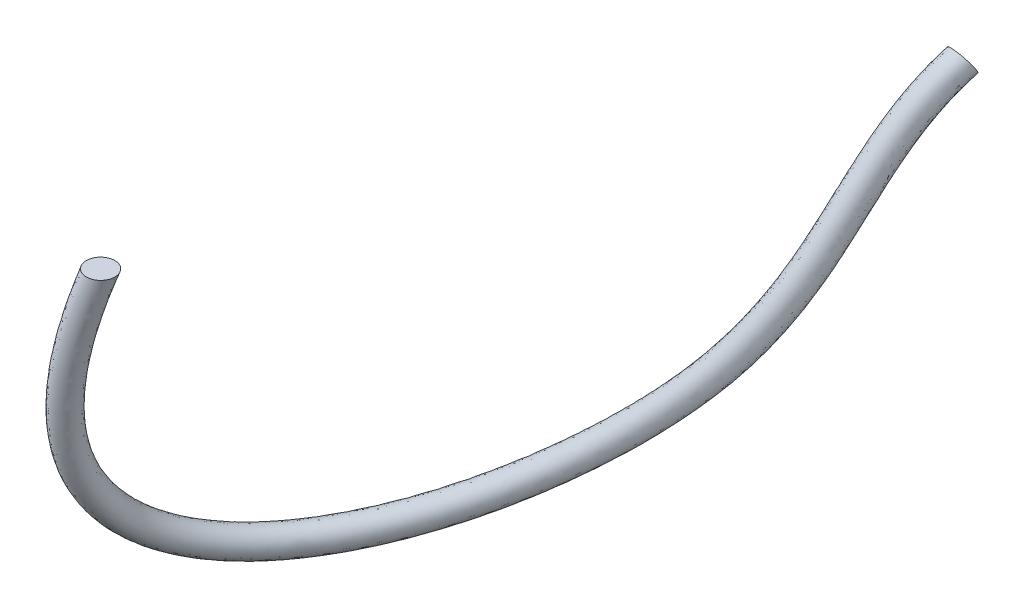
ISO-10303-21;
HEADER;
FILE_DESCRIPTION(('STEP AP214'),'2;1');
FILE_NAME('part.step','',(''),(''),'','','');
FILE_SCHEMA(('AUTOMOTIVE_DESIGN { 1 0 10303 214 1 1 1 1 }'));
ENDSEC;
DATA;
#1=APPLICATION_CONTEXT('core data for automotive mechanical design processes');
#2=APPLICATION_PROTOCOL_DEFINITION('international standard','automotive_design',2000,#1);
#3=PRODUCT_CONTEXT('',#1,'mechanical');
#4=PRODUCT('Part','Part','',(#3));
#5=PRODUCT_RELATED_PRODUCT_CATEGORY('part','',(#4));
#6=PRODUCT_DEFINITION_FORMATION('','',#4);
#7=PRODUCT_DEFINITION_CONTEXT('part definition',#1,'design');
#8=PRODUCT_DEFINITION('design','',#6,#7);
#9=PRODUCT_DEFINITION_SHAPE('','',#8);
#10=(LENGTH_UNIT() NAMED_UNIT(*) SI_UNIT(.MILLI.,.METRE.));
#11=(NAMED_UNIT(*) PLANE_ANGLE_UNIT() SI_UNIT($,.RADIAN.));
#12=(NAMED_UNIT(*) SI_UNIT($,.STERADIAN.) SOLID_ANGLE_UNIT());
#13=UNCERTAINTY_MEASURE_WITH_UNIT(LENGTH_MEASURE(1.E-05),#10,'distance_accuracy_value','');
#14=(GEOMETRIC_REPRESENTATION_CONTEXT(3) GLOBAL_UNCERTAINTY_ASSIGNED_CONTEXT((#13)) GLOBAL_UNIT_ASSIGNED_CONTEXT((#10,
#11,#12)) REPRESENTATION_CONTEXT('',''));
#15=CARTESIAN_POINT('',(0.,0.,0.));
#16=DIRECTION('',(0.,0.,1.));
#17=DIRECTION('',(1.,0.,0.));
#18=AXIS2_PLACEMENT_3D('',#15,#16,#17);
#19=CARTESIAN_POINT('',(0.,0.,0.));
#20=DIRECTION('',(0.,1.,0.));
#21=DIRECTION('',(0.,0.,1.));
#22=AXIS2_PLACEMENT_3D('',#19,#20,#21);
#23=PLANE('',#22);
#24=CARTESIAN_POINT('',(0.,0.,0.));
#25=DIRECTION('',(0.,1.,0.));
#26=DIRECTION('',(0.,0.,1.));
#27=AXIS2_PLACEMENT_3D('',#24,#25,#26);
#28=CIRCLE('',#27,12.5);
#29=CARTESIAN_POINT('',(0.,0.,12.5));
#30=VERTEX_POINT('',#29);
#31=EDGE_CURVE('E43',#30,#30,#28,.T.);
#32=ORIENTED_EDGE('',*,*,#31,.T.);
#33=EDGE_LOOP('',(#32));
#34=FACE_BOUND('',#33,.T.);
#35=ADVANCED_FACE('F40',(#34),#23,.T.);
#36=CARTESIAN_POINT('',(-38.1434596776202,-257.669947409982,-794.647687786151));
#37=DIRECTION('',(-0.0803475442884596,-0.54448992618378,0.834910170264559));
#38=DIRECTION('',(0.80262945443268,-0.532015005271432,-0.2697146511466));
#39=AXIS2_PLACEMENT_3D('',#36,#37,#38);
#40=PLANE('',#39);
#41=CARTESIAN_POINT('',(-38.1434596776202,-257.669947409982,-794.647687786151));
#42=DIRECTION('',(-0.0803475442884596,-0.54448992618378,0.834910170264559));
#43=DIRECTION('',(0.80262945443268,-0.532015005271432,-0.2697146511466));
#44=AXIS2_PLACEMENT_3D('',#41,#42,#43);
#45=CIRCLE('',#44,12.5);
#46=CARTESIAN_POINT('',(-28.1105914972117,-264.320134975875,-798.019120925484));
#47=VERTEX_POINT('',#46);
#48=EDGE_CURVE('E10',#47,#47,#45,.T.);
#49=ORIENTED_EDGE('',*,*,#48,.F.);
#50=EDGE_LOOP('',(#49));
#51=FACE_BOUND('',#50,.T.);
#52=ADVANCED_FACE('F55',(#51),#40,.F.);
#53=CARTESIAN_POINT('',(0.,0.,12.5));
#54=CARTESIAN_POINT('',(-7.22643654470373,-22.0981024096902,15.1730505252033));
#55=CARTESIAN_POINT('',(-13.0165994020231,-42.4976913189323,16.7019674865207));
#56=CARTESIAN_POINT('',(-22.0247637005753,-80.1938845209527,17.5870203037609));
#57=CARTESIAN_POINT('',(-25.2431213451697,-97.491783177638,16.9433296021655));
#58=CARTESIAN_POINT('',(-29.3852903866435,-129.262814645988,13.5730050847368));
#59=CARTESIAN_POINT('',(-30.3084082678828,-143.738470919584,10.8448288072637));
#60=CARTESIAN_POINT('',(-30.1136822525031,-170.067905663528,3.38204420674103));
#61=CARTESIAN_POINT('',(-28.9929309105626,-181.920801158909,-1.35657103344815));
#62=CARTESIAN_POINT('',(-24.9931660764793,-203.082696926862,-12.6904131284456));
#63=CARTESIAN_POINT('',(-22.114245871861,-212.384287553253,-19.2842736404802));
#64=CARTESIAN_POINT('',(-14.9787516459672,-228.52796324278,-34.0299213708688));
#65=CARTESIAN_POINT('',(-10.7264576809941,-235.370344319365,-42.175600994914));
#66=CARTESIAN_POINT('',(-1.24387092751919,-246.846781930035,-59.7162065856771));
#67=CARTESIAN_POINT('',(3.98624744379001,-251.486460110344,-69.1109332112111));
#68=CARTESIAN_POINT('',(15.0966519139014,-258.855563993099,-88.9512139091969));
#69=CARTESIAN_POINT('',(20.9800963073928,-261.58720002139,-99.3981240003482));
#70=CARTESIAN_POINT('',(30.0624975351749,-264.405919256274,-115.760965816992));
#71=CARTESIAN_POINT('',(33.1326871165852,-265.131403185288,-121.331028889438));
#72=CARTESIAN_POINT('',(36.9938432322489,-265.780779122832,-128.431327629783));
#73=CARTESIAN_POINT('',(37.7705061665808,-265.891917029712,-129.857267208386));
#74=CARTESIAN_POINT('',(39.2440198978459,-266.217033992958,-132.745834727415));
#75=CARTESIAN_POINT('',(39.9494809848379,-266.419026808544,-134.206419828553));
#76=CARTESIAN_POINT('',(42.0966695671664,-266.952191101248,-138.602149593954));
#77=CARTESIAN_POINT('',(43.5296544837135,-267.270846455676,-141.56207507012));
#78=CARTESIAN_POINT('',(50.6899513778126,-268.691083461006,-156.503739235988));
#79=CARTESIAN_POINT('',(56.4034617176189,-269.273815850384,-168.911644278196));
#80=CARTESIAN_POINT('',(73.0274168677055,-269.773005601591,-207.300186384364));
#81=CARTESIAN_POINT('',(83.4234052787309,-268.440642392741,-234.44654726169));
#82=CARTESIAN_POINT('',(100.282037663342,-264.600671913968,-290.766401686995));
#83=CARTESIAN_POINT('',(106.745299902888,-262.091437823383,-319.941700751278));
#84=CARTESIAN_POINT('',(113.10445563016,-258.058410922712,-379.196343621189));
#85=CARTESIAN_POINT('',(112.995801969881,-256.535299705237,-409.281893088104));
#86=CARTESIAN_POINT('',(105.556938339399,-256.642756706767,-456.266185613744));
#87=CARTESIAN_POINT('',(101.374328709206,-257.190540987115,-473.205994445614));
#88=CARTESIAN_POINT('',(90.9134289057197,-258.935796418327,-506.707122077295));
#89=CARTESIAN_POINT('',(84.6345208543893,-260.13344400342,-523.269681237034));
#90=CARTESIAN_POINT('',(63.8905790184547,-264.167881709411,-572.284564952275));
#91=CARTESIAN_POINT('',(47.5174761812404,-267.445606431726,-604.07358460509));
#92=CARTESIAN_POINT('',(24.002043581718,-271.15381550669,-649.862529158656));
#93=CARTESIAN_POINT('',(16.3373665895205,-272.188693362767,-664.807824307931));
#94=CARTESIAN_POINT('',(2.16719311497959,-273.511471708991,-693.9396491149));
#95=CARTESIAN_POINT('',(-4.33784888775714,-273.798969032125,-708.126604577389));
#96=CARTESIAN_POINT('',(-15.3792389311151,-273.29114711069,-735.588254929759));
#97=CARTESIAN_POINT('',(-19.9135879857565,-272.494834174395,-748.862389960614));
#98=CARTESIAN_POINT('',(-26.2380709070387,-269.512943271503,-774.308607972348));
#99=CARTESIAN_POINT('',(-28.0259624251674,-267.328073456693,-786.473680823778));
#100=CARTESIAN_POINT('',(-28.1105914972117,-264.320134975875,-798.019120925484));
#101=CARTESIAN_POINT('',(25.,0.,12.5));
#102=CARTESIAN_POINT('',(17.7735634554565,-21.5560484991579,15.0178541856007));
#103=CARTESIAN_POINT('',(11.9655562871809,-41.322279379983,16.4339597832425));
#104=CARTESIAN_POINT('',(2.84149468494016,-77.5257264341008,17.2528787796285));
#105=CARTESIAN_POINT('',(-0.474727561976159,-93.9618253137687,16.6561688806391));
#106=CARTESIAN_POINT('',(-4.9726984861487,-123.782357530498,13.6526348915241));
#107=CARTESIAN_POINT('',(-6.15590801220209,-137.165965182119,11.2481389853081));
#108=CARTESIAN_POINT('',(-6.73783822040993,-161.222572809108,4.80814443028234));
#109=CARTESIAN_POINT('',(-6.13855954985732,-171.899438702312,0.77519044623147));
#110=CARTESIAN_POINT('',(-3.43752276937991,-190.920006213129,-8.85406082391103));
#111=CARTESIAN_POINT('',(-1.33265368066558,-199.269276110077,-14.4548524356877));
#112=CARTESIAN_POINT('',(4.1694273628803,-213.875865627127,-27.2575743299452));
#113=CARTESIAN_POINT('',(7.57107986296427,-220.129386048719,-34.4638388179643));
#114=CARTESIAN_POINT('',(15.3864047119769,-230.598641361909,-50.4431366897525));
#115=CARTESIAN_POINT('',(19.8006456858977,-234.810545838135,-59.2134493945267));
#116=CARTESIAN_POINT('',(29.210992005123,-241.219962710888,-78.1849487404263));
#117=CARTESIAN_POINT('',(34.2090876439886,-243.414910499051,-88.3831778813585));
#118=CARTESIAN_POINT('',(41.6926382835383,-245.252592418254,-104.65773492324));
#119=CARTESIAN_POINT('',(44.1832474241889,-245.623098352037,-110.245856096466));
#120=CARTESIAN_POINT('',(47.2310529339166,-245.801229038063,-117.428930869969));
#121=CARTESIAN_POINT('',(47.8309634416206,-245.809887731662,-118.879701515644));
#122=CARTESIAN_POINT('',(49.1484551824271,-246.094859800652,-121.700115315776));
#123=CARTESIAN_POINT('',(49.8558540632719,-246.342084132843,-123.080540255596));
#124=CARTESIAN_POINT('',(51.9407191298238,-246.950310045848,-127.286689080497));
#125=CARTESIAN_POINT('',(53.3379423287042,-247.318780904753,-130.128435560557));
#126=CARTESIAN_POINT('',(60.3465305671853,-248.984869840958,-144.517734678361));
#127=CARTESIAN_POINT('',(66.0248998468079,-249.752764937799,-156.605895909956));
#128=CARTESIAN_POINT('',(82.74373560863,-250.727894909121,-194.331891118719));
#129=CARTESIAN_POINT('',(93.4680536813829,-249.604996463804,-221.421135898741));
#130=CARTESIAN_POINT('',(111.314601419162,-245.917289734597,-278.334522199684));
#131=CARTESIAN_POINT('',(118.448241662186,-243.351094488952,-308.167315022962));
#132=CARTESIAN_POINT('',(126.227885042547,-238.984447249345,-369.669802609909));
#133=CARTESIAN_POINT('',(126.874240982004,-237.179555290195,-401.372766942321));
#134=CARTESIAN_POINT('',(120.192504524408,-236.85763150922,-451.692262118913));
#135=CARTESIAN_POINT('',(116.142265429002,-237.312958343789,-469.668027935364));
#136=CARTESIAN_POINT('',(105.830407148839,-238.940410746446,-504.864361742691));
#137=CARTESIAN_POINT('',(99.5683218940221,-240.112456864688,-522.090091021011));
#138=CARTESIAN_POINT('',(78.853459111942,-244.117708499376,-572.603726144439));
#139=CARTESIAN_POINT('',(62.4831810310475,-247.429995693034,-604.76543326512));
#140=CARTESIAN_POINT('',(39.1471347068645,-251.265942383546,-650.205501170179));
#141=CARTESIAN_POINT('',(31.5682988326557,-252.358049477379,-664.878068510591));
#142=CARTESIAN_POINT('',(17.6090520591855,-253.863770719443,-693.06930072317));
#143=CARTESIAN_POINT('',(11.2317644961128,-254.275434864394,-706.588322114681));
#144=CARTESIAN_POINT('',(0.401135834457462,-254.181721215409,-732.159381284638));
#145=CARTESIAN_POINT('',(-4.04434766433349,-253.67404076045,-744.203618591543));
#146=CARTESIAN_POINT('',(-10.5198735695736,-251.644917670343,-766.470806154234));
#147=CARTESIAN_POINT('',(-12.555573989885,-250.13604883484,-776.660341633179));
#148=CARTESIAN_POINT('',(-13.3345502690125,-248.108820361338,-786.024877135605));
#149=CARTESIAN_POINT('',(25.,0.,-12.5));
#150=CARTESIAN_POINT('',(17.6183671157377,-20.8359339281733,-9.98214581467968));
#151=CARTESIAN_POINT('',(11.6536599676647,-39.7968666298438,-8.53523243024376));
#152=CARTESIAN_POINT('',(2.17546600495747,-74.1622989817306,-7.52873708242996));
#153=CARTESIAN_POINT('',(-1.33747621553308,-89.5630926115168,-7.96902530174392));
#154=CARTESIAN_POINT('',(-6.35288618918579,-117.060192084796,-10.4181138873203));
#155=CARTESIAN_POINT('',(-7.85820182177527,-129.150625319064,-12.4215011464751));
#156=CARTESIAN_POINT('',(-9.339671443866,-150.493319429228,-17.6753812517816));
#157=CARTESIAN_POINT('',(-9.32364097044059,-159.751212171274,-20.9153155991508));
#158=CARTESIAN_POINT('',(-8.11752556737714,-176.181337179024,-28.5789540534811));
#159=CARTESIAN_POINT('',(-6.92414308322699,-183.37395701611,-33.0098851720352));
#160=CARTESIAN_POINT('',(-3.4507406029394,-196.277004534835,-43.3953651055419));
#161=CARTESIAN_POINT('',(-1.15771994810553,-201.983040992621,-49.3664633148801));
#162=CARTESIAN_POINT('',(4.39544880492608,-211.99575809789,-63.1199511337141));
#163=CARTESIAN_POINT('',(7.65651436310129,-216.287365040691,-70.9000187467278));
#164=CARTESIAN_POINT('',(14.7327825993159,-223.429506083646,-88.2370709569131));
#165=CARTESIAN_POINT('',(18.5436589823307,-226.27305492361,-97.7883860164612));
#166=CARTESIAN_POINT('',(24.2074948375115,-229.603993977184,-113.321904095474));
#167=CARTESIAN_POINT('',(26.0853512682817,-230.560911578704,-118.700494934154));
#168=CARTESIAN_POINT('',(28.369574901387,-231.604103038394,-125.659454812885));
#169=CARTESIAN_POINT('',(28.8103654758304,-231.804102859817,-127.069304709677));
#170=CARTESIAN_POINT('',(29.9729142892153,-232.228820885382,-129.765247279347));
#171=CARTESIAN_POINT('',(30.6672695958654,-232.44842252721,-131.066207416166));
#172=CARTESIAN_POINT('',(32.6550316964863,-233.065083439481,-135.051268206346));
#173=CARTESIAN_POINT('',(33.989319061273,-233.440318994437,-137.747085130698));
#174=CARTESIAN_POINT('',(40.6917982136632,-235.144886189417,-151.412829061195));
#175=CARTESIAN_POINT('',(46.1525416394658,-235.957919106813,-162.941530445955));
#176=CARTESIAN_POINT('',(62.2873272151911,-237.085350188856,-199.002111450921));
#177=CARTESIAN_POINT('',(72.7098093899364,-236.086128988542,-224.99657353811));
#178=CARTESIAN_POINT('',(90.1398662654815,-232.628194856876,-279.550575908069));
#179=CARTESIAN_POINT('',(97.1576150133757,-230.171348600154,-308.115156457001));
#180=CARTESIAN_POINT('',(105.052728663489,-225.932715913208,-366.795038828474));
#181=CARTESIAN_POINT('',(105.939540664367,-224.145126321202,-396.931198883521));
#182=CARTESIAN_POINT('',(100.109437272771,-223.663789009972,-444.725498498762));
#183=CARTESIAN_POINT('',(96.3991893526242,-224.04498744435,-461.943716176495));
#184=CARTESIAN_POINT('',(86.7181593818826,-225.534126266952,-495.892928264852));
#185=CARTESIAN_POINT('',(80.7481470154871,-226.641634330662,-512.626603235068));
#186=CARTESIAN_POINT('',(60.7735391479702,-230.494471489432,-561.954666075751));
#187=CARTESIAN_POINT('',(44.7171820802574,-233.761202631845,-593.694468135685));
#188=CARTESIAN_POINT('',(21.5042700346375,-237.634807010782,-638.894900061399));
#189=CARTESIAN_POINT('',(13.9089938498406,-238.756722963669,-653.556970104965));
#190=CARTESIAN_POINT('',(-0.214346823131794,-240.352571334293,-681.898430210914));
#191=CARTESIAN_POINT('',(-6.74019693470208,-240.825360084168,-695.57732518921));
#192=CARTESIAN_POINT('',(-18.0112751582004,-240.862892890352,-721.732018433997));
#193=CARTESIAN_POINT('',(-22.7526436431348,-240.42732167042,-734.201135954858));
#194=CARTESIAN_POINT('',(-29.9073907194776,-238.471120651671,-757.747228056942));
#195=CARTESIAN_POINT('',(-32.3309120218825,-236.961648349966,-768.804808122601));
#196=CARTESIAN_POINT('',(-33.4002866298295,-234.808445229552,-779.28201085694));
#197=CARTESIAN_POINT('',(0.,0.,-12.5));
#198=CARTESIAN_POINT('',(-7.38163288442249,-21.3779878387056,-9.82694947507706));
#199=CARTESIAN_POINT('',(-13.3284957215393,-40.9722785687602,-8.26722472696557));
#200=CARTESIAN_POINT('',(-22.690792380558,-76.8304570686154,-7.19459555829754));
#201=CARTESIAN_POINT('',(-26.1058699987266,-93.0930504753861,-7.68186458022427));
#202=CARTESIAN_POINT('',(-30.7654780896806,-122.540649200287,-10.497743694101));
#203=CARTESIAN_POINT('',(-32.0107020774335,-135.723131056529,-12.8248113245084));
#204=CARTESIAN_POINT('',(-32.7155154759817,-159.338652283648,-19.1014814753342));
#205=CARTESIAN_POINT('',(-32.1780123311655,-169.772574627872,-23.0470770788304));
#206=CARTESIAN_POINT('',(-29.6731688744569,-188.344027892757,-32.4153063580157));
#207=CARTESIAN_POINT('',(-27.7057352744224,-196.488968459286,-37.8393063768185));
#208=CARTESIAN_POINT('',(-22.5989196117869,-210.929102150488,-50.1677121464748));
#209=CARTESIAN_POINT('',(-19.4552574920639,-217.223999263343,-57.0782254918485));
#210=CARTESIAN_POINT('',(-12.23482683457,-228.24389866594,-72.39302102962));
#211=CARTESIAN_POINT('',(-8.15788387901627,-232.963279312979,-80.7975025634122));
#212=CARTESIAN_POINT('',(0.618442508104194,-241.065107365777,-99.0033361256837));
#213=CARTESIAN_POINT('',(5.31466764573492,-244.445344446203,-108.803332135451));
#214=CARTESIAN_POINT('',(12.5773540891481,-248.757320815077,-124.425134989226));
#215=CARTESIAN_POINT('',(15.0347909606835,-250.069216411956,-129.785667727105));
#216=CARTESIAN_POINT('',(18.1323651997179,-251.583653123164,-136.661851572705));
#217=CARTESIAN_POINT('',(18.749908200792,-251.886132157878,-138.046870402414));
#218=CARTESIAN_POINT('',(20.0684790046326,-252.350995077677,-140.810966690992));
#219=CARTESIAN_POINT('',(20.7608965174301,-252.525365202922,-142.192086989117));
#220=CARTESIAN_POINT('',(22.8109821338316,-253.066964494859,-146.366728719814));
#221=CARTESIAN_POINT('',(24.1810312162851,-253.392384545337,-149.18072464026));
#222=CARTESIAN_POINT('',(31.0352190242793,-254.851099809554,-163.398833618822));
#223=CARTESIAN_POINT('',(36.5311035102768,-255.478970019492,-175.247278814195));
#224=CARTESIAN_POINT('',(52.5710084742666,-256.130460881136,-211.970406716566));
#225=CARTESIAN_POINT('',(62.6651609873344,-254.921774917479,-238.021984901459));
#226=CARTESIAN_POINT('',(79.1073025096113,-251.311577036247,-291.982455394979));
#227=CARTESIAN_POINT('',(85.4546732539763,-248.911691934382,-319.889542185318));
#228=CARTESIAN_POINT('',(91.9292992512024,-245.006679586777,-376.321579839754));
#229=CARTESIAN_POINT('',(92.0611016522438,-243.500870736448,-404.840325028895));
#230=CARTESIAN_POINT('',(85.4738710877625,-243.448914207402,-449.299421993827));
#231=CARTESIAN_POINT('',(81.6312526328279,-243.922570087676,-465.481682686744));
#232=CARTESIAN_POINT('',(71.8011811387634,-245.529511938833,-497.735688599456));
#233=CARTESIAN_POINT('',(65.8143459759152,-246.662621469516,-513.806193451091));
#234=CARTESIAN_POINT('',(45.8106590543611,-250.544644699223,-561.635504883586));
#235=CARTESIAN_POINT('',(29.7514772304205,-253.776813370061,-593.002619475655));
#236=CARTESIAN_POINT('',(6.35917890950581,-257.522680134164,-638.551928049876));
#237=CARTESIAN_POINT('',(-1.32193839328756,-258.587366849056,-653.486725902305));
#238=CARTESIAN_POINT('',(-15.6562057673447,-260.000272323842,-682.768778602645));
#239=CARTESIAN_POINT('',(-22.309810318559,-260.348894252003,-697.115607651919));
#240=CARTESIAN_POINT('',(-33.791649923786,-259.972318785529,-725.160892079118));
#241=CARTESIAN_POINT('',(-38.6218839645578,-259.248115084178,-738.85990732393));
#242=CARTESIAN_POINT('',(-45.6255880569428,-256.339146253019,-765.585029875055));
#243=CARTESIAN_POINT('',(-47.8013004570673,-254.153672971473,-778.618147313199));
#244=CARTESIAN_POINT('',(-48.1763278580287,-251.019759844089,-791.276254646819));
#245=CARTESIAN_POINT('',(-25.,0.,-12.5));
#246=CARTESIAN_POINT('',(-32.3816328845827,-21.9200417492379,-9.67175313547444));
#247=CARTESIAN_POINT('',(-38.3106514107434,-42.1476905076766,-7.99921702368739));
#248=CARTESIAN_POINT('',(-47.5570507660734,-79.4986151555001,-6.86045403416512));
#249=CARTESIAN_POINT('',(-50.8742637819202,-96.6230083392554,-7.39470385870464));
#250=CARTESIAN_POINT('',(-55.1780699901754,-128.021106315777,-10.5773735008816));
#251=CARTESIAN_POINT('',(-56.1632023330917,-142.295636793994,-13.2281215025417));
#252=CARTESIAN_POINT('',(-56.0913595080973,-168.183985138067,-20.5275816988867));
#253=CARTESIAN_POINT('',(-55.0323836918905,-179.793937084469,-25.17883855851));
#254=CARTESIAN_POINT('',(-51.2288121815366,-200.50671860649,-36.2516586625503));
#255=CARTESIAN_POINT('',(-48.4873274656179,-209.603979902462,-42.6687275816018));
#256=CARTESIAN_POINT('',(-41.7470986206344,-225.581199766141,-56.9400591874078));
#257=CARTESIAN_POINT('',(-37.7527950360222,-232.464957534065,-64.7899876688169));
#258=CARTESIAN_POINT('',(-28.865102474066,-244.492039233991,-81.6660909255259));
#259=CARTESIAN_POINT('',(-23.9722821211338,-249.639193585268,-90.6949863800967));
#260=CARTESIAN_POINT('',(-13.4958975831075,-258.700708647909,-109.769601294454));
#261=CARTESIAN_POINT('',(-7.91432369086089,-262.617633968796,-119.818278254441));
#262=CARTESIAN_POINT('',(0.947213340784767,-267.91064765297,-135.528365882979));
#263=CARTESIAN_POINT('',(3.98423065308518,-269.577521245208,-140.870840520055));
#264=CARTESIAN_POINT('',(7.89515549804892,-271.563203207933,-147.664248332525));
#265=CARTESIAN_POINT('',(8.68945092575366,-271.968161455938,-149.024436095151));
#266=CARTESIAN_POINT('',(10.16404372005,-272.473169269972,-151.856686102636));
#267=CARTESIAN_POINT('',(10.8545234389948,-272.602307878634,-153.317966562068));
#268=CARTESIAN_POINT('',(12.966932571177,-273.068845550238,-157.682189233282));
#269=CARTESIAN_POINT('',(14.3727433712972,-273.344450096237,-160.614364149823));
#270=CARTESIAN_POINT('',(21.3786398348953,-274.557313429692,-175.384838176448));
#271=CARTESIAN_POINT('',(26.9096653810878,-275.000020932172,-187.553027182435));
#272=CARTESIAN_POINT('',(42.854689733342,-275.175571573417,-224.93870198221));
#273=CARTESIAN_POINT('',(52.6205125847324,-273.757420846416,-251.047396264809));
#274=CARTESIAN_POINT('',(68.074738753741,-269.994959215618,-304.414334881889));
#275=CARTESIAN_POINT('',(73.7517314945769,-267.652035268611,-331.663927913634));
#276=CARTESIAN_POINT('',(78.8058698389161,-264.080643260347,-385.848120851034));
#277=CARTESIAN_POINT('',(78.182662640121,-262.856615151695,-412.74945117427));
#278=CARTESIAN_POINT('',(70.8383049027539,-263.234039404832,-453.873345488891));
#279=CARTESIAN_POINT('',(66.8633159130316,-263.800152731002,-469.019649196993));
#280=CARTESIAN_POINT('',(56.8842028956442,-265.524897610715,-499.578448934061));
#281=CARTESIAN_POINT('',(50.8805449363433,-266.68360860837,-514.985783667113));
#282=CARTESIAN_POINT('',(30.847778960752,-270.594817909015,-561.316343691422));
#283=CARTESIAN_POINT('',(14.7857723805836,-273.792424108277,-592.310770815625));
#284=CARTESIAN_POINT('',(-8.78591221562587,-277.410553257546,-638.208956038352));
#285=CARTESIAN_POINT('',(-16.5528706364157,-278.418010734443,-653.416481699645));
#286=CARTESIAN_POINT('',(-31.0980647115577,-279.647973313391,-683.639126994375));
#287=CARTESIAN_POINT('',(-37.879423702416,-279.872428419838,-698.653890114627));
#288=CARTESIAN_POINT('',(-49.5720246893715,-279.081744680706,-728.589765724239));
#289=CARTESIAN_POINT('',(-54.4911242859808,-278.068908497936,-743.518678693001));
#290=CARTESIAN_POINT('',(-61.3437853944079,-274.207171854367,-773.422831693169));
#291=CARTESIAN_POINT('',(-63.2716888922522,-271.345697592979,-788.431486503798));
#292=CARTESIAN_POINT('',(-62.9523690862279,-267.231074458627,-803.270498436697));
#293=CARTESIAN_POINT('',(-25.,0.,12.5));
#294=CARTESIAN_POINT('',(-32.2264365448639,-22.6401563202225,15.3282468648059));
#295=CARTESIAN_POINT('',(-37.9987550912272,-43.6731032578816,16.9699751897989));
#296=CARTESIAN_POINT('',(-46.8910220860907,-82.8620426078046,17.9211618278933));
#297=CARTESIAN_POINT('',(-50.0115151283633,-101.021741041507,17.2304903236919));
#298=CARTESIAN_POINT('',(-53.7978822871383,-134.743271761479,13.4933752779494));
#299=CARTESIAN_POINT('',(-54.4609085235634,-150.310976657049,10.4415186292192));
#300=CARTESIAN_POINT('',(-53.4895262845963,-178.913238517947,1.95594398319972));
#301=CARTESIAN_POINT('',(-51.847302271268,-191.942163615507,-3.48833251312777));
#302=CARTESIAN_POINT('',(-46.5488093835786,-215.245387640595,-16.5267654329802));
#303=CARTESIAN_POINT('',(-42.8958380630565,-225.499298996429,-24.1136948452728));
#304=CARTESIAN_POINT('',(-34.1269306548147,-243.180060858434,-40.8022684117925));
#305=CARTESIAN_POINT('',(-29.0239952249524,-250.611302590012,-49.8873631718636));
#306=CARTESIAN_POINT('',(-17.8741465670152,-263.09492249816,-68.9892764816018));
#307=CARTESIAN_POINT('',(-11.8281507983177,-268.162374382554,-79.0084170278955));
#308=CARTESIAN_POINT('',(0.98231182267985,-276.491165275309,-99.7174790779675));
#309=CARTESIAN_POINT('',(7.75110497079701,-279.759489543729,-110.413070119338));
#310=CARTESIAN_POINT('',(18.4323567868115,-283.559246094294,-126.864196710744));
#311=CARTESIAN_POINT('',(22.0821268089814,-284.63970801854,-132.416201682411));
#312=CARTESIAN_POINT('',(26.7566335305813,-285.760329207602,-139.433724389598));
#313=CARTESIAN_POINT('',(27.7100488915411,-285.973946327761,-140.834832901129));
#314=CARTESIAN_POINT('',(29.3395846132646,-286.339208185264,-143.791554139054));
#315=CARTESIAN_POINT('',(30.043107906404,-286.495969484245,-145.33229940151));
#316=CARTESIAN_POINT('',(32.252620004509,-286.954072156649,-149.917610107411));
#317=CARTESIAN_POINT('',(33.7213666387229,-287.222912006599,-152.995714579682));
#318=CARTESIAN_POINT('',(41.0333721884399,-288.397297081054,-168.489743793614));
#319=CARTESIAN_POINT('',(46.7820235884299,-288.794866762969,-181.217392646436));
#320=CARTESIAN_POINT('',(63.3110981267809,-288.818116294062,-220.268481650008));
#321=CARTESIAN_POINT('',(73.3787568760788,-287.276288321678,-247.47195862464));
#322=CARTESIAN_POINT('',(89.2494739075214,-283.284054093339,-303.198281174305));
#323=CARTESIAN_POINT('',(95.0423581435895,-280.831781157814,-331.716086479595));
#324=CARTESIAN_POINT('',(99.981026217772,-277.132374596079,-388.722884632469));
#325=CARTESIAN_POINT('',(99.1173629577585,-275.891044120279,-417.191019233886));
#326=CARTESIAN_POINT('',(90.9213721543908,-276.427881904314,-460.840109108575));
#327=CARTESIAN_POINT('',(86.6063919894098,-277.068123630441,-476.743960955863));
#328=CARTESIAN_POINT('',(75.9964506626005,-278.931182090208,-508.549882411899));
#329=CARTESIAN_POINT('',(69.7007198147565,-280.154431142152,-524.449271453057));
#330=CARTESIAN_POINT('',(48.9276989249675,-284.218054919446,-571.96540376011));
#331=CARTESIAN_POINT('',(32.5517713314332,-287.461217170419,-603.381735945061));
#332=CARTESIAN_POINT('',(8.85695245657143,-291.041688629834,-649.519557147133));
#333=CARTESIAN_POINT('',(1.10643434638538,-292.019337248154,-664.737580105271));
#334=CARTESIAN_POINT('',(-13.2746658292263,-293.15917269854,-694.809997506631));
#335=CARTESIAN_POINT('',(-19.9074622716271,-293.322503199856,-709.664887040097));
#336=CARTESIAN_POINT('',(-31.1596136966877,-292.400573005971,-739.017128574879));
#337=CARTESIAN_POINT('',(-35.7828283071795,-291.315627588341,-753.521161329686));
#338=CARTESIAN_POINT('',(-41.9562682445038,-287.380968872663,-782.146409790461));
#339=CARTESIAN_POINT('',(-43.4963508604497,-284.520098078546,-796.287020014377));
#340=CARTESIAN_POINT('',(-42.8866327254109,-280.531449590412,-810.013364715362));
#341=CARTESIAN_POINT('',(0.,0.,12.5));
#342=CARTESIAN_POINT('',(-7.22643654470373,-22.0981024096902,15.1730505252033));
#343=CARTESIAN_POINT('',(-13.0165994020231,-42.4976913189323,16.7019674865207));
#344=CARTESIAN_POINT('',(-22.0247637005753,-80.1938845209527,17.5870203037609));
#345=CARTESIAN_POINT('',(-25.2431213451697,-97.491783177638,16.9433296021655));
#346=CARTESIAN_POINT('',(-29.3852903866435,-129.262814645988,13.5730050847368));
#347=CARTESIAN_POINT('',(-30.3084082678828,-143.738470919584,10.8448288072637));
#348=CARTESIAN_POINT('',(-30.1136822525031,-170.067905663528,3.38204420674103));
#349=CARTESIAN_POINT('',(-28.9929309105626,-181.920801158909,-1.35657103344815));
#350=CARTESIAN_POINT('',(-24.9931660764793,-203.082696926862,-12.6904131284456));
#351=CARTESIAN_POINT('',(-22.114245871861,-212.384287553253,-19.2842736404802));
#352=CARTESIAN_POINT('',(-14.9787516459672,-228.52796324278,-34.0299213708688));
#353=CARTESIAN_POINT('',(-10.7264576809941,-235.370344319365,-42.175600994914));
#354=CARTESIAN_POINT('',(-1.24387092751919,-246.846781930035,-59.7162065856771));
#355=CARTESIAN_POINT('',(3.98624744379001,-251.486460110344,-69.1109332112111));
#356=CARTESIAN_POINT('',(15.0966519139014,-258.855563993099,-88.9512139091969));
#357=CARTESIAN_POINT('',(20.9800963073928,-261.58720002139,-99.3981240003482));
#358=CARTESIAN_POINT('',(30.0624975351749,-264.405919256274,-115.760965816992));
#359=CARTESIAN_POINT('',(33.1326871165852,-265.131403185288,-121.331028889438));
#360=CARTESIAN_POINT('',(36.9938432322489,-265.780779122832,-128.431327629783));
#361=CARTESIAN_POINT('',(37.7705061665808,-265.891917029712,-129.857267208386));
#362=CARTESIAN_POINT('',(39.2440198978459,-266.217033992958,-132.745834727415));
#363=CARTESIAN_POINT('',(39.9494809848379,-266.419026808544,-134.206419828553));
#364=CARTESIAN_POINT('',(42.0966695671664,-266.952191101248,-138.602149593954));
#365=CARTESIAN_POINT('',(43.5296544837135,-267.270846455676,-141.56207507012));
#366=CARTESIAN_POINT('',(50.6899513778126,-268.691083461006,-156.503739235988));
#367=CARTESIAN_POINT('',(56.4034617176189,-269.273815850384,-168.911644278196));
#368=CARTESIAN_POINT('',(73.0274168677055,-269.773005601591,-207.300186384364));
#369=CARTESIAN_POINT('',(83.4234052787309,-268.440642392741,-234.44654726169));
#370=CARTESIAN_POINT('',(100.282037663342,-264.600671913968,-290.766401686995));
#371=CARTESIAN_POINT('',(106.745299902888,-262.091437823383,-319.941700751278));
#372=CARTESIAN_POINT('',(113.10445563016,-258.058410922712,-379.196343621189));
#373=CARTESIAN_POINT('',(112.995801969881,-256.535299705237,-409.281893088104));
#374=CARTESIAN_POINT('',(105.556938339399,-256.642756706767,-456.266185613744));
#375=CARTESIAN_POINT('',(101.374328709206,-257.190540987115,-473.205994445614));
#376=CARTESIAN_POINT('',(90.9134289057197,-258.935796418327,-506.707122077295));
#377=CARTESIAN_POINT('',(84.6345208543893,-260.13344400342,-523.269681237034));
#378=CARTESIAN_POINT('',(63.8905790184547,-264.167881709411,-572.284564952275));
#379=CARTESIAN_POINT('',(47.5174761812404,-267.445606431726,-604.07358460509));
#380=CARTESIAN_POINT('',(24.002043581718,-271.15381550669,-649.862529158656));
#381=CARTESIAN_POINT('',(16.3373665895205,-272.188693362767,-664.807824307931));
#382=CARTESIAN_POINT('',(2.16719311497959,-273.511471708991,-693.9396491149));
#383=CARTESIAN_POINT('',(-4.33784888775714,-273.798969032125,-708.126604577389));
#384=CARTESIAN_POINT('',(-15.3792389311151,-273.29114711069,-735.588254929759));
#385=CARTESIAN_POINT('',(-19.9135879857565,-272.494834174395,-748.862389960614));
#386=CARTESIAN_POINT('',(-26.2380709070387,-269.512943271503,-774.308607972348));
#387=CARTESIAN_POINT('',(-28.0259624251674,-267.328073456693,-786.473680823778));
#388=CARTESIAN_POINT('',(-28.1105914972117,-264.320134975875,-798.019120925484));
#389=(BOUNDED_SURFACE() B_SPLINE_SURFACE(3,3,((#53,#54,#55,#56,#57,#58,#59,#60,#61,#62,#63,#64,
#65,#66,#67,#68,#69,#70,#71,#72,#73,#74,#75,#76,#77,#78,#79,#80,#81,#82,#83,#84,#85,#86,#87,#88,
#89,#90,#91,#92,#93,#94,#95,#96,#97,#98,#99,#100),(#101,#102,#103,#104,#105,#106,#107,#108,#109,
#110,#111,#112,#113,#114,#115,#116,#117,#118,#119,#120,#121,#122,#123,#124,#125,#126,#127,#128,
#129,#130,#131,#132,#133,#134,#135,#136,#137,#138,#139,#140,#141,#142,#143,#144,#145,#146,#147,
#148),(#149,#150,#151,#152,#153,#154,#155,#156,#157,#158,#159,#160,#161,#162,#163,#164,#165,
#166,#167,#168,#169,#170,#171,#172,#173,#174,#175,#176,#177,#178,#179,#180,#181,#182,#183,#184,
#185,#186,#187,#188,#189,#190,#191,#192,#193,#194,#195,#196),(#197,#198,#199,#200,#201,#202,
#203,#204,#205,#206,#207,#208,#209,#210,#211,#212,#213,#214,#215,#216,#217,#218,#219,#220,#221,
#222,#223,#224,#225,#226,#227,#228,#229,#230,#231,#232,#233,#234,#235,#236,#237,#238,#239,#240,
#241,#242,#243,#244),(#245,#246,#247,#248,#249,#250,#251,#252,#253,#254,#255,#256,#257,#258,
#259,#260,#261,#262,#263,#264,#265,#266,#267,#268,#269,#270,#271,#272,#273,#274,#275,#276,#277,
#278,#279,#280,#281,#282,#283,#284,#285,#286,#287,#288,#289,#290,#291,#292),(#293,#294,#295,
#296,#297,#298,#299,#300,#301,#302,#303,#304,#305,#306,#307,#308,#309,#310,#311,#312,#313,#314,
#315,#316,#317,#318,#319,#320,#321,#322,#323,#324,#325,#326,#327,#328,#329,#330,#331,#332,#333,
#334,#335,#336,#337,#338,#339,#340),(#341,#342,#343,#344,#345,#346,#347,#348,#349,#350,#351,
#352,#353,#354,#355,#356,#357,#358,#359,#360,#361,#362,#363,#364,#365,#366,#367,#368,#369,#370,
#371,#372,#373,#374,#375,#376,#377,#378,#379,#380,#381,#382,#383,#384,#385,#386,#387,#388)),
.UNSPECIFIED.,.T.,.F.,.F.) B_SPLINE_SURFACE_WITH_KNOTS((4,3,4),(4,2,2,2,2,2,2,2,2,2,2,2,2,2,2,2,
2,2,2,2,2,2,2,4),(0.,0.5,1.),(0.,0.0397677598665083,0.0795355197330167,0.119303279599525,
0.159071039466033,0.198838799332542,0.23860655919905,0.278374319065558,0.318142078932067,
0.338025958865321,0.342996928848634,0.347967898831948,0.357909838798575,0.397677598665083,
0.4772131183981,0.556748638131117,0.636284157864134,0.681748638131117,0.7272131183981,
0.818142078932067,0.86360655919905,0.909071039466033,0.954535519733017,1.),
.UNSPECIFIED.) GEOMETRIC_REPRESENTATION_ITEM() RATIONAL_B_SPLINE_SURFACE(((1.,1.,1.,1.,1.,1.,1.,
1.,1.,1.,1.,1.,1.,1.,1.,1.,1.,1.,1.,1.,1.,1.,1.,1.,1.,1.,1.,1.,1.,1.,1.,1.,1.,1.,1.,1.,1.,1.,1.,
1.,1.,1.,1.,1.,1.,1.,1.,1.),(0.333333333333333,0.333333333333333,0.333333333333333,
0.333333333333333,0.333333333333333,0.333333333333333,0.333333333333333,0.333333333333333,
0.333333333333333,0.333333333333333,0.333333333333333,0.333333333333333,0.333333333333333,
0.333333333333333,0.333333333333333,0.333333333333333,0.333333333333333,0.333333333333333,
0.333333333333333,0.333333333333333,0.333333333333333,0.333333333333333,0.333333333333333,
0.333333333333333,0.333333333333333,0.333333333333333,0.333333333333333,0.333333333333333,
0.333333333333333,0.333333333333333,0.333333333333333,0.333333333333333,0.333333333333333,
0.333333333333333,0.333333333333333,0.333333333333333,0.333333333333333,0.333333333333333,
0.333333333333333,0.333333333333333,0.333333333333333,0.333333333333333,0.333333333333333,
0.333333333333333,0.333333333333333,0.333333333333333,0.333333333333333,0.333333333333333),
(0.333333333333333,0.333333333333333,0.333333333333333,0.333333333333333,0.333333333333333,
0.333333333333333,0.333333333333333,0.333333333333333,0.333333333333333,0.333333333333333,
0.333333333333333,0.333333333333333,0.333333333333333,0.333333333333333,0.333333333333333,
0.333333333333333,0.333333333333333,0.333333333333333,0.333333333333333,0.333333333333333,
0.333333333333333,0.333333333333333,0.333333333333333,0.333333333333333,0.333333333333333,
0.333333333333333,0.333333333333333,0.333333333333333,0.333333333333333,0.333333333333333,
0.333333333333333,0.333333333333333,0.333333333333333,0.333333333333333,0.333333333333333,
0.333333333333333,0.333333333333333,0.333333333333333,0.333333333333333,0.333333333333333,
0.333333333333333,0.333333333333333,0.333333333333333,0.333333333333333,0.333333333333333,
0.333333333333333,0.333333333333333,0.333333333333333),(1.,1.,1.,1.,1.,1.,1.,1.,1.,1.,1.,1.,1.,
1.,1.,1.,1.,1.,1.,1.,1.,1.,1.,1.,1.,1.,1.,1.,1.,1.,1.,1.,1.,1.,1.,1.,1.,1.,1.,1.,1.,1.,1.,1.,1.,
1.,1.,1.),(0.333333333333333,0.333333333333333,0.333333333333333,0.333333333333333,
0.333333333333333,0.333333333333333,0.333333333333333,0.333333333333333,0.333333333333333,
0.333333333333333,0.333333333333333,0.333333333333333,0.333333333333333,0.333333333333333,
0.333333333333333,0.333333333333333,0.333333333333333,0.333333333333333,0.333333333333333,
0.333333333333333,0.333333333333333,0.333333333333333,0.333333333333333,0.333333333333333,
0.333333333333333,0.333333333333333,0.333333333333333,0.333333333333333,0.333333333333333,
0.333333333333333,0.333333333333333,0.333333333333333,0.333333333333333,0.333333333333333,
0.333333333333333,0.333333333333333,0.333333333333333,0.333333333333333,0.333333333333333,
0.333333333333333,0.333333333333333,0.333333333333333,0.333333333333333,0.333333333333333,
0.333333333333333,0.333333333333333,0.333333333333333,0.333333333333333),(0.333333333333333,
0.333333333333333,0.333333333333333,0.333333333333333,0.333333333333333,0.333333333333333,
0.333333333333333,0.333333333333333,0.333333333333333,0.333333333333333,0.333333333333333,
0.333333333333333,0.333333333333333,0.333333333333333,0.333333333333333,0.333333333333333,
0.333333333333333,0.333333333333333,0.333333333333333,0.333333333333333,0.333333333333333,
0.333333333333333,0.333333333333333,0.333333333333333,0.333333333333333,0.333333333333333,
0.333333333333333,0.333333333333333,0.333333333333333,0.333333333333333,0.333333333333333,
0.333333333333333,0.333333333333333,0.333333333333333,0.333333333333333,0.333333333333333,
0.333333333333333,0.333333333333333,0.333333333333333,0.333333333333333,0.333333333333333,
0.333333333333333,0.333333333333333,0.333333333333333,0.333333333333333,0.333333333333333,
0.333333333333333,0.333333333333333),(1.,1.,1.,1.,1.,1.,1.,1.,1.,1.,1.,1.,1.,1.,1.,1.,1.,1.,1.,
1.,1.,1.,1.,1.,1.,1.,1.,1.,1.,1.,1.,1.,1.,1.,1.,1.,1.,1.,1.,1.,1.,1.,1.,1.,1.,1.,1.,1.))) REPRESENTATION_ITEM('') SURFACE());
#390=ORIENTED_EDGE('',*,*,#48,.T.);
#391=EDGE_LOOP('',(#390));
#392=FACE_BOUND('',#391,.T.);
#393=ORIENTED_EDGE('',*,*,#31,.F.);
#394=EDGE_LOOP('',(#393));
#395=FACE_BOUND('',#394,.T.);
#396=ADVANCED_FACE('F49',(#392,#395),#389,.F.);
#397=CLOSED_SHELL('',(#35,#52,#396));
#398=MANIFOLD_SOLID_BREP('B2',#397);
#399=ADVANCED_BREP_SHAPE_REPRESENTATION('',(#18,#398),#14);
#400=SHAPE_DEFINITION_REPRESENTATION(#9,#399);
ENDSEC;
END-ISO-10303-21;
